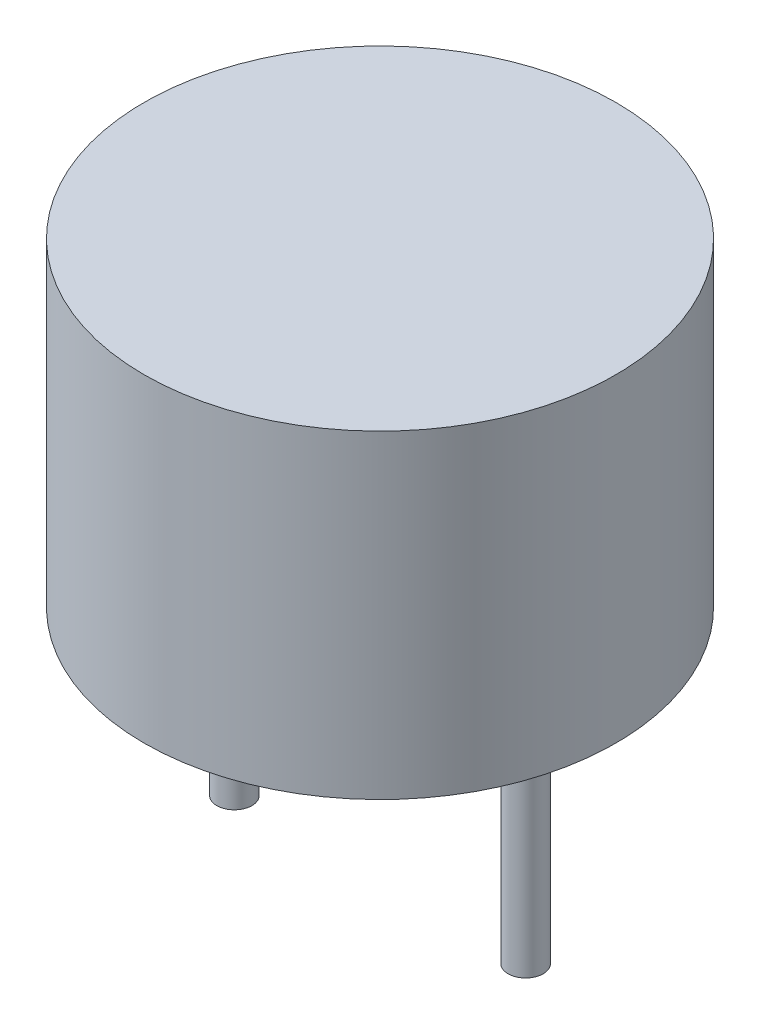
ISO-10303-21;
HEADER;
FILE_DESCRIPTION(('STEP AP214'),'2;1');
FILE_NAME('part.step','',(''),(''),'','','');
FILE_SCHEMA(('AUTOMOTIVE_DESIGN { 1 0 10303 214 1 1 1 1 }'));
ENDSEC;
DATA;
#1=APPLICATION_CONTEXT('core data for automotive mechanical design processes');
#2=APPLICATION_PROTOCOL_DEFINITION('international standard','automotive_design',2000,#1);
#3=PRODUCT_CONTEXT('',#1,'mechanical');
#4=PRODUCT('Part','Part','',(#3));
#5=PRODUCT_RELATED_PRODUCT_CATEGORY('part','',(#4));
#6=PRODUCT_DEFINITION_FORMATION('','',#4);
#7=PRODUCT_DEFINITION_CONTEXT('part definition',#1,'design');
#8=PRODUCT_DEFINITION('design','',#6,#7);
#9=PRODUCT_DEFINITION_SHAPE('','',#8);
#10=(LENGTH_UNIT() NAMED_UNIT(*) SI_UNIT(.MILLI.,.METRE.));
#11=(NAMED_UNIT(*) PLANE_ANGLE_UNIT() SI_UNIT($,.RADIAN.));
#12=(NAMED_UNIT(*) SI_UNIT($,.STERADIAN.) SOLID_ANGLE_UNIT());
#13=UNCERTAINTY_MEASURE_WITH_UNIT(LENGTH_MEASURE(1.E-05),#10,'distance_accuracy_value','');
#14=(GEOMETRIC_REPRESENTATION_CONTEXT(3) GLOBAL_UNCERTAINTY_ASSIGNED_CONTEXT((#13)) GLOBAL_UNIT_ASSIGNED_CONTEXT((#10,
#11,#12)) REPRESENTATION_CONTEXT('',''));
#15=CARTESIAN_POINT('',(0.,0.,0.));
#16=DIRECTION('',(0.,0.,1.));
#17=DIRECTION('',(1.,0.,0.));
#18=AXIS2_PLACEMENT_3D('',#15,#16,#17);
#19=CARTESIAN_POINT('',(0.,0.,0.));
#20=DIRECTION('',(0.,1.,0.));
#21=DIRECTION('',(0.,0.,1.));
#22=AXIS2_PLACEMENT_3D('',#19,#20,#21);
#23=PLANE('',#22);
#24=CARTESIAN_POINT('',(-4.05765,0.,0.));
#25=DIRECTION('',(0.,1.,0.));
#26=DIRECTION('',(0.,0.,1.));
#27=AXIS2_PLACEMENT_3D('',#24,#25,#26);
#28=CIRCLE('',#27,0.48895);
#29=CARTESIAN_POINT('',(-4.05765,0.,0.48895));
#30=VERTEX_POINT('',#29);
#31=EDGE_CURVE('E40',#30,#30,#28,.F.);
#32=ORIENTED_EDGE('',*,*,#31,.F.);
#33=EDGE_LOOP('',(#32));
#34=FACE_BOUND('',#33,.T.);
#35=CARTESIAN_POINT('',(0.,0.,0.));
#36=DIRECTION('',(0.,1.,0.));
#37=DIRECTION('',(0.,0.,1.));
#38=AXIS2_PLACEMENT_3D('',#35,#36,#37);
#39=CIRCLE('',#38,6.57225);
#40=CARTESIAN_POINT('',(0.,0.,6.57225));
#41=VERTEX_POINT('',#40);
#42=EDGE_CURVE('E48',#41,#41,#39,.T.);
#43=ORIENTED_EDGE('',*,*,#42,.F.);
#44=EDGE_LOOP('',(#43));
#45=FACE_BOUND('',#44,.T.);
#46=CARTESIAN_POINT('',(4.05765,0.,0.));
#47=DIRECTION('',(0.,1.,0.));
#48=DIRECTION('',(0.,0.,1.));
#49=AXIS2_PLACEMENT_3D('',#46,#47,#48);
#50=CIRCLE('',#49,0.488950000000001);
#51=CARTESIAN_POINT('',(4.05765,0.,0.488950000000001));
#52=VERTEX_POINT('',#51);
#53=EDGE_CURVE('E10',#52,#52,#50,.F.);
#54=ORIENTED_EDGE('',*,*,#53,.F.);
#55=EDGE_LOOP('',(#54));
#56=FACE_BOUND('',#55,.T.);
#57=ADVANCED_FACE('F33',(#34,#45,#56),#23,.F.);
#58=CARTESIAN_POINT('',(0.,8.89,0.));
#59=DIRECTION('',(0.,-1.,0.));
#60=DIRECTION('',(0.,0.,-1.));
#61=AXIS2_PLACEMENT_3D('',#58,#59,#60);
#62=CYLINDRICAL_SURFACE('',#61,6.57225);
#63=CARTESIAN_POINT('',(0.,8.89,0.));
#64=DIRECTION('',(0.,1.,0.));
#65=DIRECTION('',(0.,0.,1.));
#66=AXIS2_PLACEMENT_3D('',#63,#64,#65);
#67=CIRCLE('',#66,6.57225);
#68=CARTESIAN_POINT('',(0.,8.89,6.57225));
#69=VERTEX_POINT('',#68);
#70=EDGE_CURVE('E44',#69,#69,#67,.T.);
#71=ORIENTED_EDGE('',*,*,#70,.F.);
#72=EDGE_LOOP('',(#71));
#73=FACE_BOUND('',#72,.T.);
#74=ORIENTED_EDGE('',*,*,#42,.T.);
#75=EDGE_LOOP('',(#74));
#76=FACE_BOUND('',#75,.T.);
#77=ADVANCED_FACE('F35',(#73,#76),#62,.T.);
#78=CARTESIAN_POINT('',(0.,8.89,0.));
#79=DIRECTION('',(0.,1.,0.));
#80=DIRECTION('',(0.,0.,1.));
#81=AXIS2_PLACEMENT_3D('',#78,#79,#80);
#82=PLANE('',#81);
#83=ORIENTED_EDGE('',*,*,#70,.T.);
#84=EDGE_LOOP('',(#83));
#85=FACE_BOUND('',#84,.T.);
#86=ADVANCED_FACE('F79',(#85),#82,.T.);
#87=CARTESIAN_POINT('',(-4.05765,-6.5786,0.));
#88=DIRECTION('',(0.,1.,0.));
#89=DIRECTION('',(0.,0.,1.));
#90=AXIS2_PLACEMENT_3D('',#87,#88,#89);
#91=CYLINDRICAL_SURFACE('',#90,0.48895);
#92=CARTESIAN_POINT('',(-4.05765,-6.5786,0.));
#93=DIRECTION('',(0.,-1.,0.));
#94=DIRECTION('',(0.,0.,-1.));
#95=AXIS2_PLACEMENT_3D('',#92,#93,#94);
#96=CIRCLE('',#95,0.48895);
#97=CARTESIAN_POINT('',(-4.05765,-6.5786,-0.48895));
#98=VERTEX_POINT('',#97);
#99=EDGE_CURVE('E52',#98,#98,#96,.T.);
#100=ORIENTED_EDGE('',*,*,#99,.F.);
#101=EDGE_LOOP('',(#100));
#102=FACE_BOUND('',#101,.T.);
#103=ORIENTED_EDGE('',*,*,#31,.T.);
#104=EDGE_LOOP('',(#103));
#105=FACE_BOUND('',#104,.T.);
#106=ADVANCED_FACE('F71',(#102,#105),#91,.T.);
#107=CARTESIAN_POINT('',(-4.05765,-6.5786,0.));
#108=DIRECTION('',(0.,-1.,0.));
#109=DIRECTION('',(0.,0.,-1.));
#110=AXIS2_PLACEMENT_3D('',#107,#108,#109);
#111=PLANE('',#110);
#112=ORIENTED_EDGE('',*,*,#99,.T.);
#113=EDGE_LOOP('',(#112));
#114=FACE_BOUND('',#113,.T.);
#115=ADVANCED_FACE('F64',(#114),#111,.T.);
#116=CARTESIAN_POINT('',(4.05765,-6.5786,0.));
#117=DIRECTION('',(0.,1.,0.));
#118=DIRECTION('',(0.,0.,1.));
#119=AXIS2_PLACEMENT_3D('',#116,#117,#118);
#120=CYLINDRICAL_SURFACE('',#119,0.488950000000001);
#121=CARTESIAN_POINT('',(4.05765,-6.5786,0.));
#122=DIRECTION('',(0.,-1.,0.));
#123=DIRECTION('',(0.,0.,-1.));
#124=AXIS2_PLACEMENT_3D('',#121,#122,#123);
#125=CIRCLE('',#124,0.488950000000001);
#126=CARTESIAN_POINT('',(4.05765,-6.5786,-0.488950000000001));
#127=VERTEX_POINT('',#126);
#128=EDGE_CURVE('E56',#127,#127,#125,.T.);
#129=ORIENTED_EDGE('',*,*,#128,.F.);
#130=EDGE_LOOP('',(#129));
#131=FACE_BOUND('',#130,.T.);
#132=ORIENTED_EDGE('',*,*,#53,.T.);
#133=EDGE_LOOP('',(#132));
#134=FACE_BOUND('',#133,.T.);
#135=ADVANCED_FACE('F62',(#131,#134),#120,.T.);
#136=CARTESIAN_POINT('',(4.05765,-6.5786,0.));
#137=DIRECTION('',(0.,-1.,0.));
#138=DIRECTION('',(0.,0.,-1.));
#139=AXIS2_PLACEMENT_3D('',#136,#137,#138);
#140=PLANE('',#139);
#141=ORIENTED_EDGE('',*,*,#128,.T.);
#142=EDGE_LOOP('',(#141));
#143=FACE_BOUND('',#142,.T.);
#144=ADVANCED_FACE('F60',(#143),#140,.T.);
#145=CLOSED_SHELL('',(#57,#77,#86,#106,#115,#135,#144));
#146=MANIFOLD_SOLID_BREP('B2',#145);
#147=ADVANCED_BREP_SHAPE_REPRESENTATION('',(#18,#146),#14);
#148=SHAPE_DEFINITION_REPRESENTATION(#9,#147);
ENDSEC;
END-ISO-10303-21;
